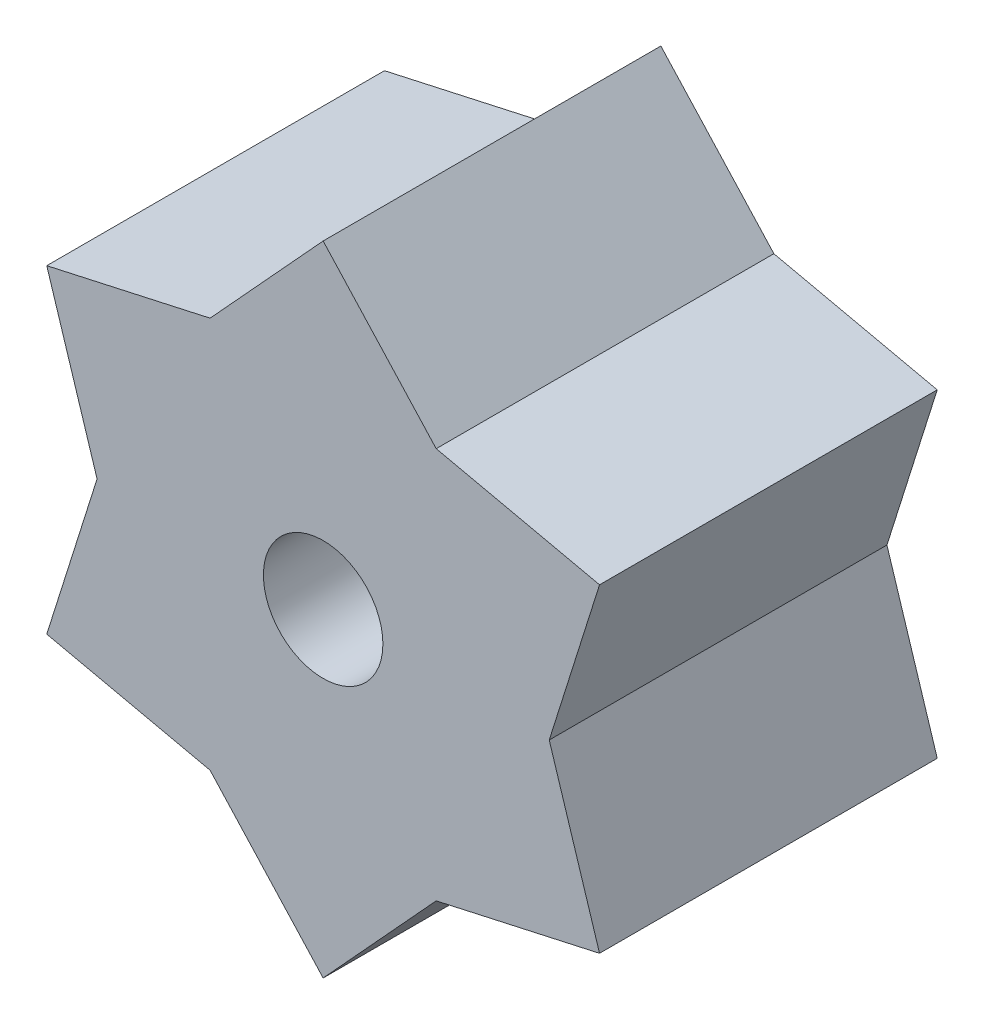
ISO-10303-21;
HEADER;
FILE_DESCRIPTION(('STEP AP214'),'2;1');
FILE_NAME('part.step','',(''),(''),'','','');
FILE_SCHEMA(('AUTOMOTIVE_DESIGN { 1 0 10303 214 1 1 1 1 }'));
ENDSEC;
DATA;
#1=APPLICATION_CONTEXT('core data for automotive mechanical design processes');
#2=APPLICATION_PROTOCOL_DEFINITION('international standard','automotive_design',2000,#1);
#3=PRODUCT_CONTEXT('',#1,'mechanical');
#4=PRODUCT('Part','Part','',(#3));
#5=PRODUCT_RELATED_PRODUCT_CATEGORY('part','',(#4));
#6=PRODUCT_DEFINITION_FORMATION('','',#4);
#7=PRODUCT_DEFINITION_CONTEXT('part definition',#1,'design');
#8=PRODUCT_DEFINITION('design','',#6,#7);
#9=PRODUCT_DEFINITION_SHAPE('','',#8);
#10=(LENGTH_UNIT() NAMED_UNIT(*) SI_UNIT(.MILLI.,.METRE.));
#11=(NAMED_UNIT(*) PLANE_ANGLE_UNIT() SI_UNIT($,.RADIAN.));
#12=(NAMED_UNIT(*) SI_UNIT($,.STERADIAN.) SOLID_ANGLE_UNIT());
#13=UNCERTAINTY_MEASURE_WITH_UNIT(LENGTH_MEASURE(1.E-05),#10,'distance_accuracy_value','');
#14=(GEOMETRIC_REPRESENTATION_CONTEXT(3) GLOBAL_UNCERTAINTY_ASSIGNED_CONTEXT((#13)) GLOBAL_UNIT_ASSIGNED_CONTEXT((#10,
#11,#12)) REPRESENTATION_CONTEXT('',''));
#15=CARTESIAN_POINT('',(0.,0.,0.));
#16=DIRECTION('',(0.,0.,1.));
#17=DIRECTION('',(1.,0.,0.));
#18=AXIS2_PLACEMENT_3D('',#15,#16,#17);
#19=CARTESIAN_POINT('',(3.95792534560514,1.24792906794276,-6.5));
#20=DIRECTION('',(-0.953716950748225,-0.300705799504278,0.));
#21=DIRECTION('',(0.300705799504278,-0.953716950748225,0.));
#22=AXIS2_PLACEMENT_3D('',#19,#20,#21);
#23=PLANE('',#22);
#24=DIRECTION('',(0.300705799504278,-0.953716950748225,0.));
#25=VECTOR('',#24,1.);
#26=CARTESIAN_POINT('',(3.95792534560514,1.24792906794276,0.));
#27=LINE('',#26,#25);
#28=CARTESIAN_POINT('',(4.35139586933438,0.,0.));
#29=VERTEX_POINT('',#28);
#30=CARTESIAN_POINT('',(5.31980094618253,-3.07138850831371,0.));
#31=VERTEX_POINT('',#30);
#32=EDGE_CURVE('E177',#29,#31,#27,.T.);
#33=ORIENTED_EDGE('',*,*,#32,.T.);
#34=DIRECTION('',(0.,0.,1.));
#35=VECTOR('',#34,1.);
#36=CARTESIAN_POINT('',(5.31980094618253,-3.07138850831371,-6.5));
#37=LINE('',#36,#35);
#38=CARTESIAN_POINT('',(5.31980094618253,-3.07138850831371,-6.5));
#39=VERTEX_POINT('',#38);
#40=EDGE_CURVE('E11',#39,#31,#37,.T.);
#41=ORIENTED_EDGE('',*,*,#40,.F.);
#42=DIRECTION('',(0.300705799504278,-0.953716950748225,0.));
#43=VECTOR('',#42,1.);
#44=CARTESIAN_POINT('',(3.95792534560514,1.24792906794276,-6.5));
#45=LINE('',#44,#43);
#46=CARTESIAN_POINT('',(4.35139586933438,0.,-6.5));
#47=VERTEX_POINT('',#46);
#48=EDGE_CURVE('E215',#47,#39,#45,.T.);
#49=ORIENTED_EDGE('',*,*,#48,.F.);
#50=DIRECTION('',(0.,0.,1.));
#51=VECTOR('',#50,1.);
#52=CARTESIAN_POINT('',(4.35139586933438,0.,-6.5));
#53=LINE('',#52,#51);
#54=EDGE_CURVE('E50',#47,#29,#53,.T.);
#55=ORIENTED_EDGE('',*,*,#54,.T.);
#56=EDGE_LOOP('',(#33,#41,#49,#55));
#57=FACE_BOUND('',#56,.T.);
#58=ADVANCED_FACE('F47',(#57),#23,.F.);
#59=CARTESIAN_POINT('',(0.898224397843139,-4.05162842954775,-6.5));
#60=DIRECTION('',(-0.216439613938104,0.976296007119933,0.));
#61=DIRECTION('',(-0.976296007119933,-0.216439613938104,0.));
#62=AXIS2_PLACEMENT_3D('',#59,#60,#61);
#63=PLANE('',#62);
#64=DIRECTION('',(-0.976296007119933,-0.216439613938104,0.));
#65=VECTOR('',#64,1.);
#66=CARTESIAN_POINT('',(0.898224397843139,-4.05162842954775,0.));
#67=LINE('',#66,#65);
#68=CARTESIAN_POINT('',(2.17569793466716,-3.76841936476627,0.));
#69=VERTEX_POINT('',#68);
#70=EDGE_CURVE('E103',#31,#69,#67,.T.);
#71=ORIENTED_EDGE('',*,*,#70,.T.);
#72=DIRECTION('',(0.,0.,1.));
#73=VECTOR('',#72,1.);
#74=CARTESIAN_POINT('',(2.17569793466716,-3.76841936476627,-6.5));
#75=LINE('',#74,#73);
#76=CARTESIAN_POINT('',(2.17569793466716,-3.76841936476627,-6.5));
#77=VERTEX_POINT('',#76);
#78=EDGE_CURVE('E57',#77,#69,#75,.T.);
#79=ORIENTED_EDGE('',*,*,#78,.F.);
#80=DIRECTION('',(-0.976296007119933,-0.216439613938104,0.));
#81=VECTOR('',#80,1.);
#82=CARTESIAN_POINT('',(0.898224397843139,-4.05162842954775,-6.5));
#83=LINE('',#82,#81);
#84=EDGE_CURVE('E65',#39,#77,#83,.T.);
#85=ORIENTED_EDGE('',*,*,#84,.F.);
#86=ORIENTED_EDGE('',*,*,#40,.T.);
#87=EDGE_LOOP('',(#71,#79,#85,#86));
#88=FACE_BOUND('',#87,.T.);
#89=ADVANCED_FACE('F273',(#88),#63,.F.);
#90=CARTESIAN_POINT('',(3.05970094776203,-2.80369936160497,-6.5));
#91=DIRECTION('',(-0.737277336810128,0.675590207615656,0.));
#92=DIRECTION('',(-0.675590207615656,-0.737277336810128,0.));
#93=AXIS2_PLACEMENT_3D('',#90,#91,#92);
#94=PLANE('',#93);
#95=DIRECTION('',(-0.675590207615656,-0.737277336810128,0.));
#96=VECTOR('',#95,1.);
#97=CARTESIAN_POINT('',(3.05970094776203,-2.80369936160497,0.));
#98=LINE('',#97,#96);
#99=CARTESIAN_POINT('',(0.,-6.14277701662742,0.));
#100=VERTEX_POINT('',#99);
#101=EDGE_CURVE('E154',#69,#100,#98,.T.);
#102=ORIENTED_EDGE('',*,*,#101,.T.);
#103=DIRECTION('',(0.,0.,1.));
#104=VECTOR('',#103,1.);
#105=CARTESIAN_POINT('',(0.,-6.14277701662742,-6.5));
#106=LINE('',#105,#104);
#107=CARTESIAN_POINT('',(0.,-6.14277701662742,-6.5));
#108=VERTEX_POINT('',#107);
#109=EDGE_CURVE('E152',#108,#100,#106,.T.);
#110=ORIENTED_EDGE('',*,*,#109,.F.);
#111=DIRECTION('',(-0.675590207615656,-0.737277336810128,0.));
#112=VECTOR('',#111,1.);
#113=CARTESIAN_POINT('',(3.05970094776203,-2.80369936160497,-6.5));
#114=LINE('',#113,#112);
#115=EDGE_CURVE('E141',#77,#108,#114,.T.);
#116=ORIENTED_EDGE('',*,*,#115,.F.);
#117=ORIENTED_EDGE('',*,*,#78,.T.);
#118=EDGE_LOOP('',(#102,#110,#116,#117));
#119=FACE_BOUND('',#118,.T.);
#120=ADVANCED_FACE('F153',(#119),#94,.F.);
#121=CARTESIAN_POINT('',(-3.05970094776203,-2.80369936160502,-6.5));
#122=DIRECTION('',(0.737277336810123,0.675590207615661,0.));
#123=DIRECTION('',(-0.675590207615661,0.737277336810123,0.));
#124=AXIS2_PLACEMENT_3D('',#121,#122,#123);
#125=PLANE('',#124);
#126=DIRECTION('',(-0.675590207615661,0.737277336810123,0.));
#127=VECTOR('',#126,1.);
#128=CARTESIAN_POINT('',(-3.05970094776203,-2.80369936160502,0.));
#129=LINE('',#128,#127);
#130=CARTESIAN_POINT('',(-2.17569793466723,-3.76841936476623,0.));
#131=VERTEX_POINT('',#130);
#132=EDGE_CURVE('E205',#100,#131,#129,.T.);
#133=ORIENTED_EDGE('',*,*,#132,.T.);
#134=DIRECTION('',(0.,0.,1.));
#135=VECTOR('',#134,1.);
#136=CARTESIAN_POINT('',(-2.17569793466723,-3.76841936476623,-6.5));
#137=LINE('',#136,#135);
#138=CARTESIAN_POINT('',(-2.17569793466723,-3.76841936476623,-6.5));
#139=VERTEX_POINT('',#138);
#140=EDGE_CURVE('E158',#139,#131,#137,.T.);
#141=ORIENTED_EDGE('',*,*,#140,.F.);
#142=DIRECTION('',(-0.675590207615661,0.737277336810123,0.));
#143=VECTOR('',#142,1.);
#144=CARTESIAN_POINT('',(-3.05970094776203,-2.80369936160502,-6.5));
#145=LINE('',#144,#143);
#146=EDGE_CURVE('E146',#108,#139,#145,.T.);
#147=ORIENTED_EDGE('',*,*,#146,.F.);
#148=ORIENTED_EDGE('',*,*,#109,.T.);
#149=EDGE_LOOP('',(#133,#141,#147,#148));
#150=FACE_BOUND('',#149,.T.);
#151=ADVANCED_FACE('F160',(#150),#125,.F.);
#152=CARTESIAN_POINT('',(-0.898224397843104,-4.05162842954773,-6.5));
#153=DIRECTION('',(0.216439613938097,0.976296007119935,0.));
#154=DIRECTION('',(-0.976296007119935,0.216439613938097,0.));
#155=AXIS2_PLACEMENT_3D('',#152,#153,#154);
#156=PLANE('',#155);
#157=DIRECTION('',(-0.976296007119935,0.216439613938097,0.));
#158=VECTOR('',#157,1.);
#159=CARTESIAN_POINT('',(-0.898224397843104,-4.05162842954773,0.));
#160=LINE('',#159,#158);
#161=CARTESIAN_POINT('',(-5.31980094618253,-3.07138850831371,0.));
#162=VERTEX_POINT('',#161);
#163=EDGE_CURVE('E202',#131,#162,#160,.T.);
#164=ORIENTED_EDGE('',*,*,#163,.T.);
#165=DIRECTION('',(0.,0.,1.));
#166=VECTOR('',#165,1.);
#167=CARTESIAN_POINT('',(-5.31980094618253,-3.07138850831371,-6.5));
#168=LINE('',#167,#166);
#169=CARTESIAN_POINT('',(-5.31980094618253,-3.07138850831371,-6.5));
#170=VERTEX_POINT('',#169);
#171=EDGE_CURVE('E221',#170,#162,#168,.T.);
#172=ORIENTED_EDGE('',*,*,#171,.F.);
#173=DIRECTION('',(-0.976296007119935,0.216439613938097,0.));
#174=VECTOR('',#173,1.);
#175=CARTESIAN_POINT('',(-0.898224397843104,-4.05162842954773,-6.5));
#176=LINE('',#175,#174);
#177=EDGE_CURVE('E164',#139,#170,#176,.T.);
#178=ORIENTED_EDGE('',*,*,#177,.F.);
#179=ORIENTED_EDGE('',*,*,#140,.T.);
#180=EDGE_LOOP('',(#164,#172,#178,#179));
#181=FACE_BOUND('',#180,.T.);
#182=ADVANCED_FACE('F286',(#181),#156,.F.);
#183=CARTESIAN_POINT('',(-3.95792534560517,1.24792906794274,-6.5));
#184=DIRECTION('',(0.953716950748227,-0.300705799504272,0.));
#185=DIRECTION('',(0.300705799504272,0.953716950748227,0.));
#186=AXIS2_PLACEMENT_3D('',#183,#184,#185);
#187=PLANE('',#186);
#188=DIRECTION('',(0.300705799504272,0.953716950748228,0.));
#189=VECTOR('',#188,1.);
#190=CARTESIAN_POINT('',(-3.95792534560517,1.24792906794274,0.));
#191=LINE('',#190,#189);
#192=CARTESIAN_POINT('',(-4.35139586933439,0.,0.));
#193=VERTEX_POINT('',#192);
#194=EDGE_CURVE('E199',#162,#193,#191,.T.);
#195=ORIENTED_EDGE('',*,*,#194,.T.);
#196=DIRECTION('',(0.,0.,1.));
#197=VECTOR('',#196,1.);
#198=CARTESIAN_POINT('',(-4.35139586933439,0.,-6.5));
#199=LINE('',#198,#197);
#200=CARTESIAN_POINT('',(-4.35139586933439,0.,-6.5));
#201=VERTEX_POINT('',#200);
#202=EDGE_CURVE('E225',#201,#193,#199,.T.);
#203=ORIENTED_EDGE('',*,*,#202,.F.);
#204=DIRECTION('',(0.300705799504272,0.953716950748228,0.));
#205=VECTOR('',#204,1.);
#206=CARTESIAN_POINT('',(-3.95792534560517,1.24792906794274,-6.5));
#207=LINE('',#206,#205);
#208=EDGE_CURVE('E167',#170,#201,#207,.T.);
#209=ORIENTED_EDGE('',*,*,#208,.F.);
#210=ORIENTED_EDGE('',*,*,#171,.T.);
#211=EDGE_LOOP('',(#195,#203,#209,#210));
#212=FACE_BOUND('',#211,.T.);
#213=ADVANCED_FACE('F289',(#212),#187,.F.);
#214=CARTESIAN_POINT('',(-3.95792534560514,-1.24792906794276,-6.5));
#215=DIRECTION('',(0.953716950748225,0.300705799504279,0.));
#216=DIRECTION('',(-0.300705799504279,0.953716950748225,0.));
#217=AXIS2_PLACEMENT_3D('',#214,#215,#216);
#218=PLANE('',#217);
#219=DIRECTION('',(-0.300705799504279,0.953716950748225,0.));
#220=VECTOR('',#219,1.);
#221=CARTESIAN_POINT('',(-3.95792534560514,-1.24792906794276,0.));
#222=LINE('',#221,#220);
#223=CARTESIAN_POINT('',(-5.31980094618253,3.07138850831371,0.));
#224=VERTEX_POINT('',#223);
#225=EDGE_CURVE('E196',#193,#224,#222,.T.);
#226=ORIENTED_EDGE('',*,*,#225,.T.);
#227=DIRECTION('',(0.,0.,1.));
#228=VECTOR('',#227,1.);
#229=CARTESIAN_POINT('',(-5.31980094618253,3.07138850831371,-6.5));
#230=LINE('',#229,#228);
#231=CARTESIAN_POINT('',(-5.31980094618253,3.07138850831371,-6.5));
#232=VERTEX_POINT('',#231);
#233=EDGE_CURVE('E229',#232,#224,#230,.T.);
#234=ORIENTED_EDGE('',*,*,#233,.F.);
#235=DIRECTION('',(-0.300705799504279,0.953716950748225,0.));
#236=VECTOR('',#235,1.);
#237=CARTESIAN_POINT('',(-3.95792534560514,-1.24792906794276,-6.5));
#238=LINE('',#237,#236);
#239=EDGE_CURVE('E331',#201,#232,#238,.T.);
#240=ORIENTED_EDGE('',*,*,#239,.F.);
#241=ORIENTED_EDGE('',*,*,#202,.T.);
#242=EDGE_LOOP('',(#226,#234,#240,#241));
#243=FACE_BOUND('',#242,.T.);
#244=ADVANCED_FACE('F293',(#243),#218,.F.);
#245=CARTESIAN_POINT('',(-0.898224397843142,4.05162842954775,-6.5));
#246=DIRECTION('',(0.216439613938105,-0.976296007119933,0.));
#247=DIRECTION('',(0.976296007119933,0.216439613938105,0.));
#248=AXIS2_PLACEMENT_3D('',#245,#246,#247);
#249=PLANE('',#248);
#250=DIRECTION('',(0.976296007119933,0.216439613938105,0.));
#251=VECTOR('',#250,1.);
#252=CARTESIAN_POINT('',(-0.898224397843142,4.05162842954775,0.));
#253=LINE('',#252,#251);
#254=CARTESIAN_POINT('',(-2.17569793466716,3.76841936476627,0.));
#255=VERTEX_POINT('',#254);
#256=EDGE_CURVE('E193',#224,#255,#253,.T.);
#257=ORIENTED_EDGE('',*,*,#256,.T.);
#258=DIRECTION('',(0.,0.,1.));
#259=VECTOR('',#258,1.);
#260=CARTESIAN_POINT('',(-2.17569793466716,3.76841936476627,-6.5));
#261=LINE('',#260,#259);
#262=CARTESIAN_POINT('',(-2.17569793466716,3.76841936476627,-6.5));
#263=VERTEX_POINT('',#262);
#264=EDGE_CURVE('E233',#263,#255,#261,.T.);
#265=ORIENTED_EDGE('',*,*,#264,.F.);
#266=DIRECTION('',(0.976296007119933,0.216439613938105,0.));
#267=VECTOR('',#266,1.);
#268=CARTESIAN_POINT('',(-0.898224397843142,4.05162842954775,-6.5));
#269=LINE('',#268,#267);
#270=EDGE_CURVE('E328',#232,#263,#269,.T.);
#271=ORIENTED_EDGE('',*,*,#270,.F.);
#272=ORIENTED_EDGE('',*,*,#233,.T.);
#273=EDGE_LOOP('',(#257,#265,#271,#272));
#274=FACE_BOUND('',#273,.T.);
#275=ADVANCED_FACE('F297',(#274),#249,.F.);
#276=CARTESIAN_POINT('',(-3.05970094776203,2.80369936160498,-6.5));
#277=DIRECTION('',(0.737277336810128,-0.675590207615656,0.));
#278=DIRECTION('',(0.675590207615656,0.737277336810128,0.));
#279=AXIS2_PLACEMENT_3D('',#276,#277,#278);
#280=PLANE('',#279);
#281=DIRECTION('',(0.675590207615656,0.737277336810128,0.));
#282=VECTOR('',#281,1.);
#283=CARTESIAN_POINT('',(-3.05970094776203,2.80369936160498,0.));
#284=LINE('',#283,#282);
#285=CARTESIAN_POINT('',(0.,6.14277701662742,0.));
#286=VERTEX_POINT('',#285);
#287=EDGE_CURVE('E190',#255,#286,#284,.T.);
#288=ORIENTED_EDGE('',*,*,#287,.T.);
#289=DIRECTION('',(0.,0.,1.));
#290=VECTOR('',#289,1.);
#291=CARTESIAN_POINT('',(0.,6.14277701662742,-6.5));
#292=LINE('',#291,#290);
#293=CARTESIAN_POINT('',(0.,6.14277701662742,-6.5));
#294=VERTEX_POINT('',#293);
#295=EDGE_CURVE('E237',#294,#286,#292,.T.);
#296=ORIENTED_EDGE('',*,*,#295,.F.);
#297=DIRECTION('',(0.675590207615656,0.737277336810128,0.));
#298=VECTOR('',#297,1.);
#299=CARTESIAN_POINT('',(-3.05970094776203,2.80369936160498,-6.5));
#300=LINE('',#299,#298);
#301=EDGE_CURVE('E321',#263,#294,#300,.T.);
#302=ORIENTED_EDGE('',*,*,#301,.F.);
#303=ORIENTED_EDGE('',*,*,#264,.T.);
#304=EDGE_LOOP('',(#288,#296,#302,#303));
#305=FACE_BOUND('',#304,.T.);
#306=ADVANCED_FACE('F301',(#305),#280,.F.);
#307=CARTESIAN_POINT('',(3.05970094776203,2.80369936160501,-6.5));
#308=DIRECTION('',(-0.737277336810123,-0.675590207615661,0.));
#309=DIRECTION('',(0.675590207615661,-0.737277336810123,0.));
#310=AXIS2_PLACEMENT_3D('',#307,#308,#309);
#311=PLANE('',#310);
#312=DIRECTION('',(0.675590207615661,-0.737277336810123,0.));
#313=VECTOR('',#312,1.);
#314=CARTESIAN_POINT('',(3.05970094776203,2.80369936160501,0.));
#315=LINE('',#314,#313);
#316=CARTESIAN_POINT('',(2.17569793466722,3.76841936476623,0.));
#317=VERTEX_POINT('',#316);
#318=EDGE_CURVE('E187',#286,#317,#315,.T.);
#319=ORIENTED_EDGE('',*,*,#318,.T.);
#320=DIRECTION('',(0.,0.,1.));
#321=VECTOR('',#320,1.);
#322=CARTESIAN_POINT('',(2.17569793466722,3.76841936476623,-6.5));
#323=LINE('',#322,#321);
#324=CARTESIAN_POINT('',(2.17569793466722,3.76841936476623,-6.5));
#325=VERTEX_POINT('',#324);
#326=EDGE_CURVE('E241',#325,#317,#323,.T.);
#327=ORIENTED_EDGE('',*,*,#326,.F.);
#328=DIRECTION('',(0.675590207615661,-0.737277336810123,0.));
#329=VECTOR('',#328,1.);
#330=CARTESIAN_POINT('',(3.05970094776203,2.80369936160501,-6.5));
#331=LINE('',#330,#329);
#332=EDGE_CURVE('E317',#294,#325,#331,.T.);
#333=ORIENTED_EDGE('',*,*,#332,.F.);
#334=ORIENTED_EDGE('',*,*,#295,.T.);
#335=EDGE_LOOP('',(#319,#327,#333,#334));
#336=FACE_BOUND('',#335,.T.);
#337=ADVANCED_FACE('F269',(#336),#311,.F.);
#338=CARTESIAN_POINT('',(0.898224397843106,4.05162842954773,-6.5));
#339=DIRECTION('',(-0.216439613938098,-0.976296007119934,0.));
#340=DIRECTION('',(0.976296007119934,-0.216439613938098,0.));
#341=AXIS2_PLACEMENT_3D('',#338,#339,#340);
#342=PLANE('',#341);
#343=DIRECTION('',(0.976296007119935,-0.216439613938098,0.));
#344=VECTOR('',#343,1.);
#345=CARTESIAN_POINT('',(0.898224397843106,4.05162842954773,0.));
#346=LINE('',#345,#344);
#347=CARTESIAN_POINT('',(5.31980094618253,3.07138850831371,0.));
#348=VERTEX_POINT('',#347);
#349=EDGE_CURVE('E184',#317,#348,#346,.T.);
#350=ORIENTED_EDGE('',*,*,#349,.T.);
#351=DIRECTION('',(0.,0.,1.));
#352=VECTOR('',#351,1.);
#353=CARTESIAN_POINT('',(5.31980094618253,3.07138850831371,-6.5));
#354=LINE('',#353,#352);
#355=CARTESIAN_POINT('',(5.31980094618253,3.07138850831371,-6.5));
#356=VERTEX_POINT('',#355);
#357=EDGE_CURVE('E244',#356,#348,#354,.T.);
#358=ORIENTED_EDGE('',*,*,#357,.F.);
#359=DIRECTION('',(0.976296007119935,-0.216439613938098,0.));
#360=VECTOR('',#359,1.);
#361=CARTESIAN_POINT('',(0.898224397843106,4.05162842954773,-6.5));
#362=LINE('',#361,#360);
#363=EDGE_CURVE('E315',#325,#356,#362,.T.);
#364=ORIENTED_EDGE('',*,*,#363,.F.);
#365=ORIENTED_EDGE('',*,*,#326,.T.);
#366=EDGE_LOOP('',(#350,#358,#364,#365));
#367=FACE_BOUND('',#366,.T.);
#368=ADVANCED_FACE('F262',(#367),#342,.F.);
#369=CARTESIAN_POINT('',(3.95792534560517,-1.24792906794274,-6.5));
#370=DIRECTION('',(-0.953716950748227,0.300705799504272,0.));
#371=DIRECTION('',(-0.300705799504272,-0.953716950748227,0.));
#372=AXIS2_PLACEMENT_3D('',#369,#370,#371);
#373=PLANE('',#372);
#374=DIRECTION('',(-0.300705799504272,-0.953716950748227,0.));
#375=VECTOR('',#374,1.);
#376=CARTESIAN_POINT('',(3.95792534560517,-1.24792906794274,0.));
#377=LINE('',#376,#375);
#378=EDGE_CURVE('E181',#348,#29,#377,.T.);
#379=ORIENTED_EDGE('',*,*,#378,.T.);
#380=ORIENTED_EDGE('',*,*,#54,.F.);
#381=DIRECTION('',(-0.300705799504272,-0.953716950748227,0.));
#382=VECTOR('',#381,1.);
#383=CARTESIAN_POINT('',(3.95792534560517,-1.24792906794274,-6.5));
#384=LINE('',#383,#382);
#385=EDGE_CURVE('E115',#356,#47,#384,.T.);
#386=ORIENTED_EDGE('',*,*,#385,.F.);
#387=ORIENTED_EDGE('',*,*,#357,.T.);
#388=EDGE_LOOP('',(#379,#380,#386,#387));
#389=FACE_BOUND('',#388,.T.);
#390=ADVANCED_FACE('F259',(#389),#373,.F.);
#391=CARTESIAN_POINT('',(0.,0.,-6.5));
#392=DIRECTION('',(0.,0.,1.));
#393=DIRECTION('',(1.,0.,0.));
#394=AXIS2_PLACEMENT_3D('',#391,#392,#393);
#395=CYLINDRICAL_SURFACE('',#394,1.15);
#396=CARTESIAN_POINT('',(0.,0.,-6.5));
#397=DIRECTION('',(0.,0.,1.));
#398=DIRECTION('',(1.,0.,0.));
#399=AXIS2_PLACEMENT_3D('',#396,#397,#398);
#400=CIRCLE('',#399,1.15);
#401=CARTESIAN_POINT('',(1.15,0.,-6.5));
#402=VERTEX_POINT('',#401);
#403=EDGE_CURVE('E173',#402,#402,#400,.T.);
#404=CARTESIAN_POINT('',(0.,0.,0.));
#405=DIRECTION('',(0.,0.,1.));
#406=DIRECTION('',(1.,0.,0.));
#407=AXIS2_PLACEMENT_3D('',#404,#405,#406);
#408=CIRCLE('',#407,1.15);
#409=CARTESIAN_POINT('',(1.15,0.,0.));
#410=VERTEX_POINT('',#409);
#411=EDGE_CURVE('E212',#410,#410,#408,.T.);
#412=CARTESIAN_POINT('',(1.15,0.,-6.5));
#413=CARTESIAN_POINT('',(1.15,0.,-6.43229166666667));
#414=CARTESIAN_POINT('',(1.15,0.,-6.36458333333333));
#415=CARTESIAN_POINT('',(1.15,0.,-6.22916666666667));
#416=CARTESIAN_POINT('',(1.15,0.,-6.16145833333333));
#417=CARTESIAN_POINT('',(1.15,0.,-6.02604166666667));
#418=CARTESIAN_POINT('',(1.15,0.,-5.95833333333333));
#419=CARTESIAN_POINT('',(1.15,0.,-5.82291666666667));
#420=CARTESIAN_POINT('',(1.15,0.,-5.75520833333333));
#421=CARTESIAN_POINT('',(1.15,0.,-5.61979166666667));
#422=CARTESIAN_POINT('',(1.15,0.,-5.55208333333333));
#423=CARTESIAN_POINT('',(1.15,0.,-5.41666666666667));
#424=CARTESIAN_POINT('',(1.15,0.,-5.34895833333333));
#425=CARTESIAN_POINT('',(1.15,0.,-5.21354166666667));
#426=CARTESIAN_POINT('',(1.15,0.,-5.14583333333333));
#427=CARTESIAN_POINT('',(1.15,0.,-5.01041666666667));
#428=CARTESIAN_POINT('',(1.15,0.,-4.94270833333333));
#429=CARTESIAN_POINT('',(1.15,0.,-4.80729166666667));
#430=CARTESIAN_POINT('',(1.15,0.,-4.73958333333333));
#431=CARTESIAN_POINT('',(1.15,0.,-4.60416666666667));
#432=CARTESIAN_POINT('',(1.15,0.,-4.53645833333333));
#433=CARTESIAN_POINT('',(1.15,0.,-4.40104166666667));
#434=CARTESIAN_POINT('',(1.15,0.,-4.33333333333333));
#435=CARTESIAN_POINT('',(1.15,0.,-4.19791666666667));
#436=CARTESIAN_POINT('',(1.15,0.,-4.13020833333333));
#437=CARTESIAN_POINT('',(1.15,0.,-3.99479166666667));
#438=CARTESIAN_POINT('',(1.15,0.,-3.92708333333333));
#439=CARTESIAN_POINT('',(1.15,0.,-3.79166666666667));
#440=CARTESIAN_POINT('',(1.15,0.,-3.72395833333333));
#441=CARTESIAN_POINT('',(1.15,0.,-3.58854166666667));
#442=CARTESIAN_POINT('',(1.15,0.,-3.52083333333333));
#443=CARTESIAN_POINT('',(1.15,0.,-3.38541666666667));
#444=CARTESIAN_POINT('',(1.15,0.,-3.31770833333333));
#445=CARTESIAN_POINT('',(1.15,0.,-3.18229166666667));
#446=CARTESIAN_POINT('',(1.15,0.,-3.11458333333333));
#447=CARTESIAN_POINT('',(1.15,0.,-2.97916666666667));
#448=CARTESIAN_POINT('',(1.15,0.,-2.91145833333333));
#449=CARTESIAN_POINT('',(1.15,0.,-2.77604166666667));
#450=CARTESIAN_POINT('',(1.15,0.,-2.70833333333333));
#451=CARTESIAN_POINT('',(1.15,0.,-2.57291666666667));
#452=CARTESIAN_POINT('',(1.15,0.,-2.50520833333333));
#453=CARTESIAN_POINT('',(1.15,0.,-2.36979166666667));
#454=CARTESIAN_POINT('',(1.15,0.,-2.30208333333333));
#455=CARTESIAN_POINT('',(1.15,0.,-2.16666666666667));
#456=CARTESIAN_POINT('',(1.15,0.,-2.09895833333333));
#457=CARTESIAN_POINT('',(1.15,0.,-1.96354166666667));
#458=CARTESIAN_POINT('',(1.15,0.,-1.89583333333333));
#459=CARTESIAN_POINT('',(1.15,0.,-1.76041666666667));
#460=CARTESIAN_POINT('',(1.15,0.,-1.69270833333333));
#461=CARTESIAN_POINT('',(1.15,0.,-1.55729166666667));
#462=CARTESIAN_POINT('',(1.15,0.,-1.48958333333333));
#463=CARTESIAN_POINT('',(1.15,0.,-1.35416666666667));
#464=CARTESIAN_POINT('',(1.15,0.,-1.28645833333333));
#465=CARTESIAN_POINT('',(1.15,0.,-1.15104166666667));
#466=CARTESIAN_POINT('',(1.15,0.,-1.08333333333333));
#467=CARTESIAN_POINT('',(1.15,0.,-0.947916666666667));
#468=CARTESIAN_POINT('',(1.15,0.,-0.880208333333333));
#469=CARTESIAN_POINT('',(1.15,0.,-0.744791666666667));
#470=CARTESIAN_POINT('',(1.15,0.,-0.677083333333334));
#471=CARTESIAN_POINT('',(1.15,0.,-0.541666666666667));
#472=CARTESIAN_POINT('',(1.15,0.,-0.473958333333334));
#473=CARTESIAN_POINT('',(1.15,0.,-0.338541666666667));
#474=CARTESIAN_POINT('',(1.15,0.,-0.270833333333334));
#475=CARTESIAN_POINT('',(1.15,0.,-0.135416666666667));
#476=CARTESIAN_POINT('',(1.15,0.,-0.0677083333333333));
#477=CARTESIAN_POINT('',(1.15,0.,0.));
#478=B_SPLINE_CURVE_WITH_KNOTS('',3,(#412,#413,#414,#415,#416,#417,#418,#419,#420,#421,#422,
#423,#424,#425,#426,#427,#428,#429,#430,#431,#432,#433,#434,#435,#436,#437,#438,#439,#440,#441,
#442,#443,#444,#445,#446,#447,#448,#449,#450,#451,#452,#453,#454,#455,#456,#457,#458,#459,#460,
#461,#462,#463,#464,#465,#466,#467,#468,#469,#470,#471,#472,#473,#474,#475,#476,#477),
.UNSPECIFIED.,.F.,.F.,(4,2,2,2,2,2,2,2,2,2,2,2,2,2,2,2,2,2,2,2,2,2,2,2,2,2,2,2,2,2,2,2,4),(0.,
0.203125,0.40625,0.609375000000001,0.812500000000001,1.015625,1.21875,1.421875,1.625,1.828125,
2.03125,2.234375,2.4375,2.640625,2.84375,3.046875,3.25,3.453125,3.65625,3.859375,4.0625,
4.265625,4.46875,4.671875,4.875,5.078125,5.28125,5.484375,5.6875,5.890625,6.09375,6.296875,6.5),.UNSPECIFIED.);
#479=EDGE_CURVE('BSEAM261',#402,#410,#478,.T.);
#480=ORIENTED_EDGE('',*,*,#403,.F.);
#481=ORIENTED_EDGE('',*,*,#411,.T.);
#482=ORIENTED_EDGE('',*,*,#479,.T.);
#483=ORIENTED_EDGE('',*,*,#479,.F.);
#484=EDGE_LOOP('',(#480,#482,#481,#483));
#485=FACE_BOUND('',#484,.T.);
#486=ADVANCED_FACE('F261',(#485),#395,.F.);
#487=CARTESIAN_POINT('',(0.,0.,-6.5));
#488=DIRECTION('',(0.,0.,1.));
#489=DIRECTION('',(1.,0.,0.));
#490=AXIS2_PLACEMENT_3D('',#487,#488,#489);
#491=PLANE('',#490);
#492=ORIENTED_EDGE('',*,*,#48,.T.);
#493=ORIENTED_EDGE('',*,*,#84,.T.);
#494=ORIENTED_EDGE('',*,*,#115,.T.);
#495=ORIENTED_EDGE('',*,*,#146,.T.);
#496=ORIENTED_EDGE('',*,*,#177,.T.);
#497=ORIENTED_EDGE('',*,*,#208,.T.);
#498=ORIENTED_EDGE('',*,*,#239,.T.);
#499=ORIENTED_EDGE('',*,*,#270,.T.);
#500=ORIENTED_EDGE('',*,*,#301,.T.);
#501=ORIENTED_EDGE('',*,*,#332,.T.);
#502=ORIENTED_EDGE('',*,*,#363,.T.);
#503=ORIENTED_EDGE('',*,*,#385,.T.);
#504=EDGE_LOOP('',(#492,#493,#494,#495,#496,#497,#498,#499,#500,#501,#502,#503));
#505=FACE_BOUND('',#504,.T.);
#506=ORIENTED_EDGE('',*,*,#403,.T.);
#507=EDGE_LOOP('',(#506));
#508=FACE_BOUND('',#507,.T.);
#509=ADVANCED_FACE('F143',(#505,#508),#491,.F.);
#510=CARTESIAN_POINT('',(0.,0.,0.));
#511=DIRECTION('',(0.,0.,1.));
#512=DIRECTION('',(1.,0.,0.));
#513=AXIS2_PLACEMENT_3D('',#510,#511,#512);
#514=PLANE('',#513);
#515=ORIENTED_EDGE('',*,*,#32,.F.);
#516=ORIENTED_EDGE('',*,*,#378,.F.);
#517=ORIENTED_EDGE('',*,*,#349,.F.);
#518=ORIENTED_EDGE('',*,*,#318,.F.);
#519=ORIENTED_EDGE('',*,*,#287,.F.);
#520=ORIENTED_EDGE('',*,*,#256,.F.);
#521=ORIENTED_EDGE('',*,*,#225,.F.);
#522=ORIENTED_EDGE('',*,*,#194,.F.);
#523=ORIENTED_EDGE('',*,*,#163,.F.);
#524=ORIENTED_EDGE('',*,*,#132,.F.);
#525=ORIENTED_EDGE('',*,*,#101,.F.);
#526=ORIENTED_EDGE('',*,*,#70,.F.);
#527=EDGE_LOOP('',(#515,#516,#517,#518,#519,#520,#521,#522,#523,#524,#525,#526));
#528=FACE_BOUND('',#527,.T.);
#529=ORIENTED_EDGE('',*,*,#411,.F.);
#530=EDGE_LOOP('',(#529));
#531=FACE_BOUND('',#530,.T.);
#532=ADVANCED_FACE('F255',(#528,#531),#514,.T.);
#533=CLOSED_SHELL('',(#58,#89,#120,#151,#182,#213,#244,#275,#306,#337,#368,#390,#486,#509,#532));
#534=MANIFOLD_SOLID_BREP('B2',#533);
#535=ADVANCED_BREP_SHAPE_REPRESENTATION('',(#18,#534),#14);
#536=SHAPE_DEFINITION_REPRESENTATION(#9,#535);
ENDSEC;
END-ISO-10303-21;
